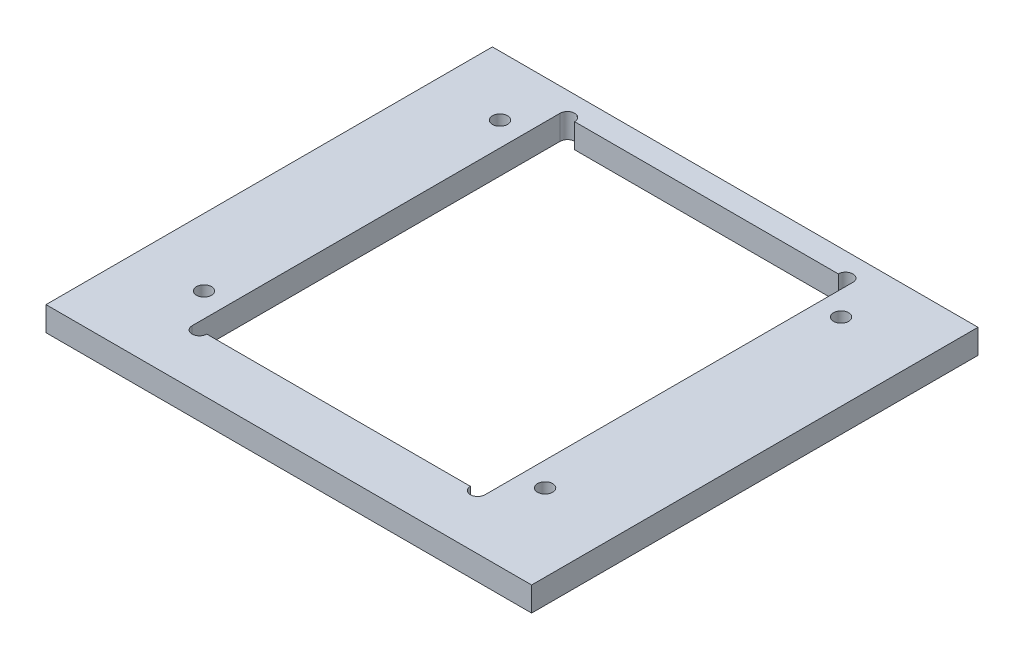
ISO-10303-21;
HEADER;
FILE_DESCRIPTION(('STEP AP214'),'2;1');
FILE_NAME('part.step','',(''),(''),'','','');
FILE_SCHEMA(('AUTOMOTIVE_DESIGN { 1 0 10303 214 1 1 1 1 }'));
ENDSEC;
DATA;
#1=APPLICATION_CONTEXT('core data for automotive mechanical design processes');
#2=APPLICATION_PROTOCOL_DEFINITION('international standard','automotive_design',2000,#1);
#3=PRODUCT_CONTEXT('',#1,'mechanical');
#4=PRODUCT('Part','Part','',(#3));
#5=PRODUCT_RELATED_PRODUCT_CATEGORY('part','',(#4));
#6=PRODUCT_DEFINITION_FORMATION('','',#4);
#7=PRODUCT_DEFINITION_CONTEXT('part definition',#1,'design');
#8=PRODUCT_DEFINITION('design','',#6,#7);
#9=PRODUCT_DEFINITION_SHAPE('','',#8);
#10=(LENGTH_UNIT() NAMED_UNIT(*) SI_UNIT(.MILLI.,.METRE.));
#11=(NAMED_UNIT(*) PLANE_ANGLE_UNIT() SI_UNIT($,.RADIAN.));
#12=(NAMED_UNIT(*) SI_UNIT($,.STERADIAN.) SOLID_ANGLE_UNIT());
#13=UNCERTAINTY_MEASURE_WITH_UNIT(LENGTH_MEASURE(1.E-05),#10,'distance_accuracy_value','');
#14=(GEOMETRIC_REPRESENTATION_CONTEXT(3) GLOBAL_UNCERTAINTY_ASSIGNED_CONTEXT((#13)) GLOBAL_UNIT_ASSIGNED_CONTEXT((#10,
#11,#12)) REPRESENTATION_CONTEXT('',''));
#15=CARTESIAN_POINT('',(0.,0.,0.));
#16=DIRECTION('',(0.,0.,1.));
#17=DIRECTION('',(1.,0.,0.));
#18=AXIS2_PLACEMENT_3D('',#15,#16,#17);
#19=CARTESIAN_POINT('',(0.,5.,0.));
#20=DIRECTION('',(0.,1.,0.));
#21=DIRECTION('',(0.,0.,1.));
#22=AXIS2_PLACEMENT_3D('',#19,#20,#21);
#23=PLANE('',#22);
#24=CARTESIAN_POINT('',(-28.55,5.,37.75));
#25=DIRECTION('',(0.,1.,0.));
#26=DIRECTION('',(0.,0.,-1.));
#27=AXIS2_PLACEMENT_3D('',#24,#25,#26);
#28=CIRCLE('',#27,1.5);
#29=CARTESIAN_POINT('',(-30.05,5.,37.75));
#30=VERTEX_POINT('',#29);
#31=CARTESIAN_POINT('',(-27.05,5.,37.75));
#32=VERTEX_POINT('',#31);
#33=EDGE_CURVE('E62',#30,#32,#28,.T.);
#34=ORIENTED_EDGE('',*,*,#33,.F.);
#35=DIRECTION('',(0.,0.,1.));
#36=VECTOR('',#35,1.);
#37=CARTESIAN_POINT('',(-30.05,5.,-37.75));
#38=LINE('',#37,#36);
#39=CARTESIAN_POINT('',(-30.05,5.,-37.75));
#40=VERTEX_POINT('',#39);
#41=EDGE_CURVE('E151',#40,#30,#38,.T.);
#42=ORIENTED_EDGE('',*,*,#41,.F.);
#43=CARTESIAN_POINT('',(-28.55,5.,-37.75));
#44=DIRECTION('',(0.,1.,0.));
#45=DIRECTION('',(0.,0.,-1.));
#46=AXIS2_PLACEMENT_3D('',#43,#44,#45);
#47=CIRCLE('',#46,1.5);
#48=CARTESIAN_POINT('',(-27.05,5.,-37.75));
#49=VERTEX_POINT('',#48);
#50=EDGE_CURVE('E214',#49,#40,#47,.T.);
#51=ORIENTED_EDGE('',*,*,#50,.F.);
#52=DIRECTION('',(-1.,0.,0.));
#53=VECTOR('',#52,1.);
#54=CARTESIAN_POINT('',(-30.05,5.,-37.75));
#55=LINE('',#54,#53);
#56=CARTESIAN_POINT('',(27.05,5.,-37.75));
#57=VERTEX_POINT('',#56);
#58=EDGE_CURVE('E156',#57,#49,#55,.T.);
#59=ORIENTED_EDGE('',*,*,#58,.F.);
#60=CARTESIAN_POINT('',(28.55,5.,-37.75));
#61=DIRECTION('',(0.,1.,0.));
#62=DIRECTION('',(0.,0.,1.));
#63=AXIS2_PLACEMENT_3D('',#60,#61,#62);
#64=CIRCLE('',#63,1.5);
#65=CARTESIAN_POINT('',(30.05,5.,-37.75));
#66=VERTEX_POINT('',#65);
#67=EDGE_CURVE('E54',#66,#57,#64,.T.);
#68=ORIENTED_EDGE('',*,*,#67,.F.);
#69=DIRECTION('',(0.,0.,-1.));
#70=VECTOR('',#69,1.);
#71=CARTESIAN_POINT('',(30.05,5.,-37.75));
#72=LINE('',#71,#70);
#73=CARTESIAN_POINT('',(30.05,5.,37.75));
#74=VERTEX_POINT('',#73);
#75=EDGE_CURVE('E146',#74,#66,#72,.T.);
#76=ORIENTED_EDGE('',*,*,#75,.F.);
#77=CARTESIAN_POINT('',(28.55,5.,37.75));
#78=DIRECTION('',(0.,1.,0.));
#79=DIRECTION('',(0.,0.,1.));
#80=AXIS2_PLACEMENT_3D('',#77,#78,#79);
#81=CIRCLE('',#80,1.5);
#82=CARTESIAN_POINT('',(27.05,5.,37.75));
#83=VERTEX_POINT('',#82);
#84=EDGE_CURVE('E130',#83,#74,#81,.T.);
#85=ORIENTED_EDGE('',*,*,#84,.F.);
#86=DIRECTION('',(1.,0.,0.));
#87=VECTOR('',#86,1.);
#88=CARTESIAN_POINT('',(-30.05,5.,37.75));
#89=LINE('',#88,#87);
#90=EDGE_CURVE('E144',#32,#83,#89,.T.);
#91=ORIENTED_EDGE('',*,*,#90,.F.);
#92=EDGE_LOOP('',(#34,#42,#51,#59,#68,#76,#85,#91));
#93=FACE_BOUND('',#92,.T.);
#94=CARTESIAN_POINT('',(-35.,5.,-30.3693177121691));
#95=DIRECTION('',(0.,1.,0.));
#96=DIRECTION('',(0.,0.,1.));
#97=AXIS2_PLACEMENT_3D('',#94,#95,#96);
#98=CIRCLE('',#97,1.55);
#99=CARTESIAN_POINT('',(-35.,5.,-28.8193177121691));
#100=VERTEX_POINT('',#99);
#101=EDGE_CURVE('E224',#100,#100,#98,.T.);
#102=ORIENTED_EDGE('',*,*,#101,.F.);
#103=EDGE_LOOP('',(#102));
#104=FACE_BOUND('',#103,.T.);
#105=CARTESIAN_POINT('',(-35.,5.,30.3693177121685));
#106=DIRECTION('',(0.,1.,0.));
#107=DIRECTION('',(0.,0.,1.));
#108=AXIS2_PLACEMENT_3D('',#105,#106,#107);
#109=CIRCLE('',#108,1.55);
#110=CARTESIAN_POINT('',(-35.,5.,31.9193177121685));
#111=VERTEX_POINT('',#110);
#112=EDGE_CURVE('E235',#111,#111,#109,.T.);
#113=ORIENTED_EDGE('',*,*,#112,.F.);
#114=EDGE_LOOP('',(#113));
#115=FACE_BOUND('',#114,.T.);
#116=CARTESIAN_POINT('',(35.,5.,30.3693177121685));
#117=DIRECTION('',(0.,1.,0.));
#118=DIRECTION('',(0.,0.,1.));
#119=AXIS2_PLACEMENT_3D('',#116,#117,#118);
#120=CIRCLE('',#119,1.55);
#121=CARTESIAN_POINT('',(35.,5.,31.9193177121685));
#122=VERTEX_POINT('',#121);
#123=EDGE_CURVE('E229',#122,#122,#120,.T.);
#124=ORIENTED_EDGE('',*,*,#123,.F.);
#125=EDGE_LOOP('',(#124));
#126=FACE_BOUND('',#125,.T.);
#127=CARTESIAN_POINT('',(35.,5.,-30.3693177121691));
#128=DIRECTION('',(0.,1.,0.));
#129=DIRECTION('',(0.,0.,1.));
#130=AXIS2_PLACEMENT_3D('',#127,#128,#129);
#131=CIRCLE('',#130,1.55);
#132=CARTESIAN_POINT('',(35.,5.,-28.8193177121691));
#133=VERTEX_POINT('',#132);
#134=EDGE_CURVE('E228',#133,#133,#131,.T.);
#135=ORIENTED_EDGE('',*,*,#134,.F.);
#136=EDGE_LOOP('',(#135));
#137=FACE_BOUND('',#136,.T.);
#138=DIRECTION('',(0.,0.,1.));
#139=VECTOR('',#138,1.);
#140=CARTESIAN_POINT('',(-48.7889095792323,5.,-42.6002222642092));
#141=LINE('',#140,#139);
#142=CARTESIAN_POINT('',(-48.7889095792323,5.,-42.6002222642092));
#143=VERTEX_POINT('',#142);
#144=CARTESIAN_POINT('',(-48.7889095792323,5.,49.0032696477231));
#145=VERTEX_POINT('',#144);
#146=EDGE_CURVE('E180',#143,#145,#141,.T.);
#147=ORIENTED_EDGE('',*,*,#146,.T.);
#148=DIRECTION('',(1.,0.,0.));
#149=VECTOR('',#148,1.);
#150=CARTESIAN_POINT('',(-48.7889095792323,5.,49.0032696477231));
#151=LINE('',#150,#149);
#152=CARTESIAN_POINT('',(50.8676365667161,5.,49.0032696477231));
#153=VERTEX_POINT('',#152);
#154=EDGE_CURVE('E183',#145,#153,#151,.T.);
#155=ORIENTED_EDGE('',*,*,#154,.T.);
#156=DIRECTION('',(0.,0.,-1.));
#157=VECTOR('',#156,1.);
#158=CARTESIAN_POINT('',(50.8676365667161,5.,-42.6002222642092));
#159=LINE('',#158,#157);
#160=CARTESIAN_POINT('',(50.8676365667161,5.,-42.6002222642092));
#161=VERTEX_POINT('',#160);
#162=EDGE_CURVE('E186',#153,#161,#159,.T.);
#163=ORIENTED_EDGE('',*,*,#162,.T.);
#164=DIRECTION('',(-1.,0.,0.));
#165=VECTOR('',#164,1.);
#166=CARTESIAN_POINT('',(-48.7889095792323,5.,-42.6002222642092));
#167=LINE('',#166,#165);
#168=EDGE_CURVE('E188',#161,#143,#167,.T.);
#169=ORIENTED_EDGE('',*,*,#168,.T.);
#170=EDGE_LOOP('',(#147,#155,#163,#169));
#171=FACE_BOUND('',#170,.T.);
#172=ADVANCED_FACE('F40',(#93,#104,#115,#126,#137,#171),#23,.T.);
#173=CARTESIAN_POINT('',(0.,0.,0.));
#174=DIRECTION('',(0.,1.,0.));
#175=DIRECTION('',(0.,0.,1.));
#176=AXIS2_PLACEMENT_3D('',#173,#174,#175);
#177=PLANE('',#176);
#178=CARTESIAN_POINT('',(-35.,0.,-30.3693177121691));
#179=DIRECTION('',(0.,1.,0.));
#180=DIRECTION('',(0.,0.,1.));
#181=AXIS2_PLACEMENT_3D('',#178,#179,#180);
#182=CIRCLE('',#181,1.55);
#183=CARTESIAN_POINT('',(-35.,0.,-28.8193177121691));
#184=VERTEX_POINT('',#183);
#185=EDGE_CURVE('E238',#184,#184,#182,.T.);
#186=ORIENTED_EDGE('',*,*,#185,.T.);
#187=EDGE_LOOP('',(#186));
#188=FACE_BOUND('',#187,.T.);
#189=CARTESIAN_POINT('',(-35.,0.,30.3693177121685));
#190=DIRECTION('',(0.,1.,0.));
#191=DIRECTION('',(0.,0.,1.));
#192=AXIS2_PLACEMENT_3D('',#189,#190,#191);
#193=CIRCLE('',#192,1.55);
#194=CARTESIAN_POINT('',(-35.,0.,31.9193177121685));
#195=VERTEX_POINT('',#194);
#196=EDGE_CURVE('E232',#195,#195,#193,.T.);
#197=ORIENTED_EDGE('',*,*,#196,.T.);
#198=EDGE_LOOP('',(#197));
#199=FACE_BOUND('',#198,.T.);
#200=CARTESIAN_POINT('',(35.,0.,30.3693177121685));
#201=DIRECTION('',(0.,1.,0.));
#202=DIRECTION('',(0.,0.,1.));
#203=AXIS2_PLACEMENT_3D('',#200,#201,#202);
#204=CIRCLE('',#203,1.55);
#205=CARTESIAN_POINT('',(35.,0.,31.9193177121685));
#206=VERTEX_POINT('',#205);
#207=EDGE_CURVE('E225',#206,#206,#204,.T.);
#208=ORIENTED_EDGE('',*,*,#207,.T.);
#209=EDGE_LOOP('',(#208));
#210=FACE_BOUND('',#209,.T.);
#211=CARTESIAN_POINT('',(35.,0.,-30.3693177121691));
#212=DIRECTION('',(0.,1.,0.));
#213=DIRECTION('',(0.,0.,1.));
#214=AXIS2_PLACEMENT_3D('',#211,#212,#213);
#215=CIRCLE('',#214,1.55);
#216=CARTESIAN_POINT('',(35.,0.,-28.8193177121691));
#217=VERTEX_POINT('',#216);
#218=EDGE_CURVE('E164',#217,#217,#215,.T.);
#219=ORIENTED_EDGE('',*,*,#218,.T.);
#220=EDGE_LOOP('',(#219));
#221=FACE_BOUND('',#220,.T.);
#222=DIRECTION('',(0.,0.,1.));
#223=VECTOR('',#222,1.);
#224=CARTESIAN_POINT('',(-48.7889095792323,0.,-42.6002222642092));
#225=LINE('',#224,#223);
#226=CARTESIAN_POINT('',(-48.7889095792323,0.,-42.6002222642092));
#227=VERTEX_POINT('',#226);
#228=CARTESIAN_POINT('',(-48.7889095792323,0.,49.0032696477231));
#229=VERTEX_POINT('',#228);
#230=EDGE_CURVE('E179',#227,#229,#225,.T.);
#231=ORIENTED_EDGE('',*,*,#230,.F.);
#232=DIRECTION('',(-1.,0.,0.));
#233=VECTOR('',#232,1.);
#234=CARTESIAN_POINT('',(-48.7889095792323,0.,-42.6002222642092));
#235=LINE('',#234,#233);
#236=CARTESIAN_POINT('',(50.8676365667161,0.,-42.6002222642092));
#237=VERTEX_POINT('',#236);
#238=EDGE_CURVE('E184',#237,#227,#235,.T.);
#239=ORIENTED_EDGE('',*,*,#238,.F.);
#240=DIRECTION('',(0.,0.,-1.));
#241=VECTOR('',#240,1.);
#242=CARTESIAN_POINT('',(50.8676365667161,0.,-42.6002222642092));
#243=LINE('',#242,#241);
#244=CARTESIAN_POINT('',(50.8676365667161,0.,49.0032696477231));
#245=VERTEX_POINT('',#244);
#246=EDGE_CURVE('E195',#245,#237,#243,.T.);
#247=ORIENTED_EDGE('',*,*,#246,.F.);
#248=DIRECTION('',(1.,0.,0.));
#249=VECTOR('',#248,1.);
#250=CARTESIAN_POINT('',(-48.7889095792323,0.,49.0032696477231));
#251=LINE('',#250,#249);
#252=EDGE_CURVE('E193',#229,#245,#251,.T.);
#253=ORIENTED_EDGE('',*,*,#252,.F.);
#254=EDGE_LOOP('',(#231,#239,#247,#253));
#255=FACE_BOUND('',#254,.T.);
#256=DIRECTION('',(0.,0.,1.));
#257=VECTOR('',#256,1.);
#258=CARTESIAN_POINT('',(-30.05,0.,-37.75));
#259=LINE('',#258,#257);
#260=CARTESIAN_POINT('',(-30.05,0.,-37.75));
#261=VERTEX_POINT('',#260);
#262=CARTESIAN_POINT('',(-30.05,0.,37.75));
#263=VERTEX_POINT('',#262);
#264=EDGE_CURVE('E167',#261,#263,#259,.T.);
#265=ORIENTED_EDGE('',*,*,#264,.T.);
#266=CARTESIAN_POINT('',(-28.55,0.,37.75));
#267=DIRECTION('',(0.,1.,0.));
#268=DIRECTION('',(0.,0.,-1.));
#269=AXIS2_PLACEMENT_3D('',#266,#267,#268);
#270=CIRCLE('',#269,1.5);
#271=CARTESIAN_POINT('',(-27.05,0.,37.75));
#272=VERTEX_POINT('',#271);
#273=EDGE_CURVE('E209',#263,#272,#270,.T.);
#274=ORIENTED_EDGE('',*,*,#273,.T.);
#275=DIRECTION('',(1.,0.,0.));
#276=VECTOR('',#275,1.);
#277=CARTESIAN_POINT('',(-30.05,0.,37.75));
#278=LINE('',#277,#276);
#279=CARTESIAN_POINT('',(27.05,0.,37.75));
#280=VERTEX_POINT('',#279);
#281=EDGE_CURVE('E170',#272,#280,#278,.T.);
#282=ORIENTED_EDGE('',*,*,#281,.T.);
#283=CARTESIAN_POINT('',(28.55,0.,37.75));
#284=DIRECTION('',(0.,1.,0.));
#285=DIRECTION('',(0.,0.,1.));
#286=AXIS2_PLACEMENT_3D('',#283,#284,#285);
#287=CIRCLE('',#286,1.5);
#288=CARTESIAN_POINT('',(30.05,0.,37.75));
#289=VERTEX_POINT('',#288);
#290=EDGE_CURVE('E133',#280,#289,#287,.T.);
#291=ORIENTED_EDGE('',*,*,#290,.T.);
#292=DIRECTION('',(0.,0.,-1.));
#293=VECTOR('',#292,1.);
#294=CARTESIAN_POINT('',(30.05,0.,-37.75));
#295=LINE('',#294,#293);
#296=CARTESIAN_POINT('',(30.05,0.,-37.75));
#297=VERTEX_POINT('',#296);
#298=EDGE_CURVE('E160',#289,#297,#295,.T.);
#299=ORIENTED_EDGE('',*,*,#298,.T.);
#300=CARTESIAN_POINT('',(28.55,0.,-37.75));
#301=DIRECTION('',(0.,1.,0.));
#302=DIRECTION('',(0.,0.,1.));
#303=AXIS2_PLACEMENT_3D('',#300,#301,#302);
#304=CIRCLE('',#303,1.5);
#305=CARTESIAN_POINT('',(27.05,0.,-37.75));
#306=VERTEX_POINT('',#305);
#307=EDGE_CURVE('E147',#297,#306,#304,.T.);
#308=ORIENTED_EDGE('',*,*,#307,.T.);
#309=DIRECTION('',(-1.,0.,0.));
#310=VECTOR('',#309,1.);
#311=CARTESIAN_POINT('',(-30.05,0.,-37.75));
#312=LINE('',#311,#310);
#313=CARTESIAN_POINT('',(-27.05,0.,-37.75));
#314=VERTEX_POINT('',#313);
#315=EDGE_CURVE('E163',#306,#314,#312,.T.);
#316=ORIENTED_EDGE('',*,*,#315,.T.);
#317=CARTESIAN_POINT('',(-28.55,0.,-37.75));
#318=DIRECTION('',(0.,1.,0.));
#319=DIRECTION('',(0.,0.,-1.));
#320=AXIS2_PLACEMENT_3D('',#317,#318,#319);
#321=CIRCLE('',#320,1.5);
#322=EDGE_CURVE('E216',#314,#261,#321,.T.);
#323=ORIENTED_EDGE('',*,*,#322,.T.);
#324=EDGE_LOOP('',(#265,#274,#282,#291,#299,#308,#316,#323));
#325=FACE_BOUND('',#324,.T.);
#326=ADVANCED_FACE('F211',(#188,#199,#210,#221,#255,#325),#177,.F.);
#327=CARTESIAN_POINT('',(-48.7889095792323,5.,-42.6002222642092));
#328=DIRECTION('',(1.,0.,0.));
#329=DIRECTION('',(0.,0.,-1.));
#330=AXIS2_PLACEMENT_3D('',#327,#328,#329);
#331=PLANE('',#330);
#332=ORIENTED_EDGE('',*,*,#230,.T.);
#333=DIRECTION('',(0.,-1.,0.));
#334=VECTOR('',#333,1.);
#335=CARTESIAN_POINT('',(-48.7889095792323,5.,49.0032696477231));
#336=LINE('',#335,#334);
#337=EDGE_CURVE('E138',#145,#229,#336,.T.);
#338=ORIENTED_EDGE('',*,*,#337,.F.);
#339=ORIENTED_EDGE('',*,*,#146,.F.);
#340=DIRECTION('',(0.,-1.,0.));
#341=VECTOR('',#340,1.);
#342=CARTESIAN_POINT('',(-48.7889095792323,5.,-42.6002222642092));
#343=LINE('',#342,#341);
#344=EDGE_CURVE('E190',#143,#227,#343,.T.);
#345=ORIENTED_EDGE('',*,*,#344,.T.);
#346=EDGE_LOOP('',(#332,#338,#339,#345));
#347=FACE_BOUND('',#346,.T.);
#348=ADVANCED_FACE('F42',(#347),#331,.F.);
#349=CARTESIAN_POINT('',(-48.7889095792323,5.,49.0032696477231));
#350=DIRECTION('',(0.,0.,-1.));
#351=DIRECTION('',(-1.,0.,0.));
#352=AXIS2_PLACEMENT_3D('',#349,#350,#351);
#353=PLANE('',#352);
#354=ORIENTED_EDGE('',*,*,#252,.T.);
#355=DIRECTION('',(0.,-1.,0.));
#356=VECTOR('',#355,1.);
#357=CARTESIAN_POINT('',(50.8676365667161,5.,49.0032696477231));
#358=LINE('',#357,#356);
#359=EDGE_CURVE('E203',#153,#245,#358,.T.);
#360=ORIENTED_EDGE('',*,*,#359,.F.);
#361=ORIENTED_EDGE('',*,*,#154,.F.);
#362=ORIENTED_EDGE('',*,*,#337,.T.);
#363=EDGE_LOOP('',(#354,#360,#361,#362));
#364=FACE_BOUND('',#363,.T.);
#365=ADVANCED_FACE('F285',(#364),#353,.F.);
#366=CARTESIAN_POINT('',(50.8676365667161,5.,-42.6002222642092));
#367=DIRECTION('',(-1.,0.,0.));
#368=DIRECTION('',(0.,0.,1.));
#369=AXIS2_PLACEMENT_3D('',#366,#367,#368);
#370=PLANE('',#369);
#371=ORIENTED_EDGE('',*,*,#246,.T.);
#372=DIRECTION('',(0.,-1.,0.));
#373=VECTOR('',#372,1.);
#374=CARTESIAN_POINT('',(50.8676365667161,5.,-42.6002222642092));
#375=LINE('',#374,#373);
#376=EDGE_CURVE('E200',#161,#237,#375,.T.);
#377=ORIENTED_EDGE('',*,*,#376,.F.);
#378=ORIENTED_EDGE('',*,*,#162,.F.);
#379=ORIENTED_EDGE('',*,*,#359,.T.);
#380=EDGE_LOOP('',(#371,#377,#378,#379));
#381=FACE_BOUND('',#380,.T.);
#382=ADVANCED_FACE('F282',(#381),#370,.F.);
#383=CARTESIAN_POINT('',(-48.7889095792323,5.,-42.6002222642092));
#384=DIRECTION('',(0.,0.,1.));
#385=DIRECTION('',(1.,0.,0.));
#386=AXIS2_PLACEMENT_3D('',#383,#384,#385);
#387=PLANE('',#386);
#388=ORIENTED_EDGE('',*,*,#238,.T.);
#389=ORIENTED_EDGE('',*,*,#344,.F.);
#390=ORIENTED_EDGE('',*,*,#168,.F.);
#391=ORIENTED_EDGE('',*,*,#376,.T.);
#392=EDGE_LOOP('',(#388,#389,#390,#391));
#393=FACE_BOUND('',#392,.T.);
#394=ADVANCED_FACE('F279',(#393),#387,.F.);
#395=CARTESIAN_POINT('',(30.05,5.,-37.75));
#396=DIRECTION('',(-1.,0.,0.));
#397=DIRECTION('',(0.,0.,1.));
#398=AXIS2_PLACEMENT_3D('',#395,#396,#397);
#399=PLANE('',#398);
#400=ORIENTED_EDGE('',*,*,#298,.F.);
#401=DIRECTION('',(0.,-1.,0.));
#402=VECTOR('',#401,1.);
#403=CARTESIAN_POINT('',(30.05,5.,37.75));
#404=LINE('',#403,#402);
#405=EDGE_CURVE('E150',#74,#289,#404,.T.);
#406=ORIENTED_EDGE('',*,*,#405,.F.);
#407=ORIENTED_EDGE('',*,*,#75,.T.);
#408=DIRECTION('',(0.,-1.,0.));
#409=VECTOR('',#408,1.);
#410=CARTESIAN_POINT('',(30.05,5.,-37.75));
#411=LINE('',#410,#409);
#412=EDGE_CURVE('E176',#66,#297,#411,.T.);
#413=ORIENTED_EDGE('',*,*,#412,.T.);
#414=EDGE_LOOP('',(#400,#406,#407,#413));
#415=FACE_BOUND('',#414,.T.);
#416=ADVANCED_FACE('F268',(#415),#399,.T.);
#417=CARTESIAN_POINT('',(-30.05,5.,-37.75));
#418=DIRECTION('',(0.,0.,1.));
#419=DIRECTION('',(1.,0.,0.));
#420=AXIS2_PLACEMENT_3D('',#417,#418,#419);
#421=PLANE('',#420);
#422=DIRECTION('',(0.,1.,0.));
#423=VECTOR('',#422,1.);
#424=CARTESIAN_POINT('',(-27.05,0.,-37.75));
#425=LINE('',#424,#423);
#426=EDGE_CURVE('E221',#314,#49,#425,.T.);
#427=ORIENTED_EDGE('',*,*,#426,.F.);
#428=ORIENTED_EDGE('',*,*,#315,.F.);
#429=DIRECTION('',(0.,1.,0.));
#430=VECTOR('',#429,1.);
#431=CARTESIAN_POINT('',(27.05,0.,-37.75));
#432=LINE('',#431,#430);
#433=EDGE_CURVE('E11',#57,#306,#432,.F.);
#434=ORIENTED_EDGE('',*,*,#433,.F.);
#435=ORIENTED_EDGE('',*,*,#58,.T.);
#436=EDGE_LOOP('',(#427,#428,#434,#435));
#437=FACE_BOUND('',#436,.T.);
#438=ADVANCED_FACE('F251',(#437),#421,.T.);
#439=CARTESIAN_POINT('',(-30.05,5.,-37.75));
#440=DIRECTION('',(1.,0.,0.));
#441=DIRECTION('',(0.,0.,-1.));
#442=AXIS2_PLACEMENT_3D('',#439,#440,#441);
#443=PLANE('',#442);
#444=ORIENTED_EDGE('',*,*,#264,.F.);
#445=DIRECTION('',(0.,-1.,0.));
#446=VECTOR('',#445,1.);
#447=CARTESIAN_POINT('',(-30.05,5.,-37.75));
#448=LINE('',#447,#446);
#449=EDGE_CURVE('E174',#40,#261,#448,.T.);
#450=ORIENTED_EDGE('',*,*,#449,.F.);
#451=ORIENTED_EDGE('',*,*,#41,.T.);
#452=DIRECTION('',(0.,-1.,0.));
#453=VECTOR('',#452,1.);
#454=CARTESIAN_POINT('',(-30.05,5.,37.75));
#455=LINE('',#454,#453);
#456=EDGE_CURVE('E153',#30,#263,#455,.T.);
#457=ORIENTED_EDGE('',*,*,#456,.T.);
#458=EDGE_LOOP('',(#444,#450,#451,#457));
#459=FACE_BOUND('',#458,.T.);
#460=ADVANCED_FACE('F259',(#459),#443,.T.);
#461=CARTESIAN_POINT('',(-30.05,5.,37.75));
#462=DIRECTION('',(0.,0.,-1.));
#463=DIRECTION('',(-1.,0.,0.));
#464=AXIS2_PLACEMENT_3D('',#461,#462,#463);
#465=PLANE('',#464);
#466=DIRECTION('',(0.,1.,0.));
#467=VECTOR('',#466,1.);
#468=CARTESIAN_POINT('',(-27.05,0.,37.75));
#469=LINE('',#468,#467);
#470=EDGE_CURVE('E48',#32,#272,#469,.F.);
#471=ORIENTED_EDGE('',*,*,#470,.F.);
#472=ORIENTED_EDGE('',*,*,#90,.T.);
#473=DIRECTION('',(0.,1.,0.));
#474=VECTOR('',#473,1.);
#475=CARTESIAN_POINT('',(27.05,0.,37.75));
#476=LINE('',#475,#474);
#477=EDGE_CURVE('E127',#280,#83,#476,.T.);
#478=ORIENTED_EDGE('',*,*,#477,.F.);
#479=ORIENTED_EDGE('',*,*,#281,.F.);
#480=EDGE_LOOP('',(#471,#472,#478,#479));
#481=FACE_BOUND('',#480,.T.);
#482=ADVANCED_FACE('F149',(#481),#465,.T.);
#483=CARTESIAN_POINT('',(35.,0.,-30.3693177121691));
#484=DIRECTION('',(0.,1.,0.));
#485=DIRECTION('',(0.,0.,1.));
#486=AXIS2_PLACEMENT_3D('',#483,#484,#485);
#487=CYLINDRICAL_SURFACE('',#486,1.55);
#488=ORIENTED_EDGE('',*,*,#218,.F.);
#489=EDGE_LOOP('',(#488));
#490=FACE_BOUND('',#489,.T.);
#491=ORIENTED_EDGE('',*,*,#134,.T.);
#492=EDGE_LOOP('',(#491));
#493=FACE_BOUND('',#492,.T.);
#494=ADVANCED_FACE('F266',(#490,#493),#487,.F.);
#495=CARTESIAN_POINT('',(35.,0.,30.3693177121685));
#496=DIRECTION('',(0.,1.,0.));
#497=DIRECTION('',(0.,0.,1.));
#498=AXIS2_PLACEMENT_3D('',#495,#496,#497);
#499=CYLINDRICAL_SURFACE('',#498,1.55);
#500=ORIENTED_EDGE('',*,*,#207,.F.);
#501=EDGE_LOOP('',(#500));
#502=FACE_BOUND('',#501,.T.);
#503=ORIENTED_EDGE('',*,*,#123,.T.);
#504=EDGE_LOOP('',(#503));
#505=FACE_BOUND('',#504,.T.);
#506=ADVANCED_FACE('F382',(#502,#505),#499,.F.);
#507=CARTESIAN_POINT('',(-35.,0.,30.3693177121685));
#508=DIRECTION('',(0.,1.,0.));
#509=DIRECTION('',(0.,0.,1.));
#510=AXIS2_PLACEMENT_3D('',#507,#508,#509);
#511=CYLINDRICAL_SURFACE('',#510,1.55);
#512=ORIENTED_EDGE('',*,*,#196,.F.);
#513=EDGE_LOOP('',(#512));
#514=FACE_BOUND('',#513,.T.);
#515=ORIENTED_EDGE('',*,*,#112,.T.);
#516=EDGE_LOOP('',(#515));
#517=FACE_BOUND('',#516,.T.);
#518=ADVANCED_FACE('F385',(#514,#517),#511,.F.);
#519=CARTESIAN_POINT('',(-35.,0.,-30.3693177121691));
#520=DIRECTION('',(0.,1.,0.));
#521=DIRECTION('',(0.,0.,1.));
#522=AXIS2_PLACEMENT_3D('',#519,#520,#521);
#523=CYLINDRICAL_SURFACE('',#522,1.55);
#524=ORIENTED_EDGE('',*,*,#185,.F.);
#525=EDGE_LOOP('',(#524));
#526=FACE_BOUND('',#525,.T.);
#527=ORIENTED_EDGE('',*,*,#101,.T.);
#528=EDGE_LOOP('',(#527));
#529=FACE_BOUND('',#528,.T.);
#530=ADVANCED_FACE('F350',(#526,#529),#523,.F.);
#531=CARTESIAN_POINT('',(28.55,0.,37.75));
#532=DIRECTION('',(0.,1.,0.));
#533=DIRECTION('',(0.,0.,1.));
#534=AXIS2_PLACEMENT_3D('',#531,#532,#533);
#535=CYLINDRICAL_SURFACE('',#534,1.5);
#536=ORIENTED_EDGE('',*,*,#477,.T.);
#537=ORIENTED_EDGE('',*,*,#84,.T.);
#538=ORIENTED_EDGE('',*,*,#405,.T.);
#539=ORIENTED_EDGE('',*,*,#290,.F.);
#540=EDGE_LOOP('',(#536,#537,#538,#539));
#541=FACE_BOUND('',#540,.T.);
#542=ADVANCED_FACE('F129',(#541),#535,.F.);
#543=CARTESIAN_POINT('',(-28.55,0.,37.75));
#544=DIRECTION('',(0.,1.,0.));
#545=DIRECTION('',(0.,0.,1.));
#546=AXIS2_PLACEMENT_3D('',#543,#544,#545);
#547=CYLINDRICAL_SURFACE('',#546,1.5);
#548=ORIENTED_EDGE('',*,*,#456,.F.);
#549=ORIENTED_EDGE('',*,*,#33,.T.);
#550=ORIENTED_EDGE('',*,*,#470,.T.);
#551=ORIENTED_EDGE('',*,*,#273,.F.);
#552=EDGE_LOOP('',(#548,#549,#550,#551));
#553=FACE_BOUND('',#552,.T.);
#554=ADVANCED_FACE('F208',(#553),#547,.F.);
#555=CARTESIAN_POINT('',(-28.55,0.,-37.75));
#556=DIRECTION('',(0.,1.,0.));
#557=DIRECTION('',(0.,0.,1.));
#558=AXIS2_PLACEMENT_3D('',#555,#556,#557);
#559=CYLINDRICAL_SURFACE('',#558,1.5);
#560=ORIENTED_EDGE('',*,*,#426,.T.);
#561=ORIENTED_EDGE('',*,*,#50,.T.);
#562=ORIENTED_EDGE('',*,*,#449,.T.);
#563=ORIENTED_EDGE('',*,*,#322,.F.);
#564=EDGE_LOOP('',(#560,#561,#562,#563));
#565=FACE_BOUND('',#564,.T.);
#566=ADVANCED_FACE('F257',(#565),#559,.F.);
#567=CARTESIAN_POINT('',(28.55,0.,-37.75));
#568=DIRECTION('',(0.,1.,0.));
#569=DIRECTION('',(0.,0.,1.));
#570=AXIS2_PLACEMENT_3D('',#567,#568,#569);
#571=CYLINDRICAL_SURFACE('',#570,1.5);
#572=ORIENTED_EDGE('',*,*,#412,.F.);
#573=ORIENTED_EDGE('',*,*,#67,.T.);
#574=ORIENTED_EDGE('',*,*,#433,.T.);
#575=ORIENTED_EDGE('',*,*,#307,.F.);
#576=EDGE_LOOP('',(#572,#573,#574,#575));
#577=FACE_BOUND('',#576,.T.);
#578=ADVANCED_FACE('F369',(#577),#571,.F.);
#579=CLOSED_SHELL('',(#172,#326,#348,#365,#382,#394,#416,#438,#460,#482,#494,#506,#518,#530,
#542,#554,#566,#578));
#580=MANIFOLD_SOLID_BREP('B2',#579);
#581=ADVANCED_BREP_SHAPE_REPRESENTATION('',(#18,#580),#14);
#582=SHAPE_DEFINITION_REPRESENTATION(#9,#581);
ENDSEC;
END-ISO-10303-21;
